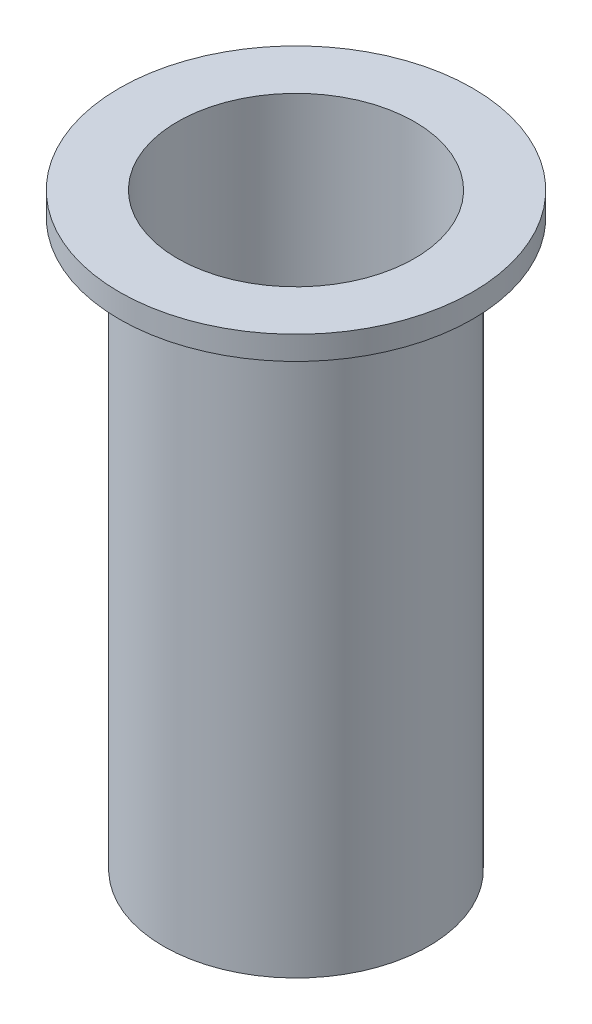
ISO-10303-21;
HEADER;
FILE_DESCRIPTION(('STEP AP214'),'2;1');
FILE_NAME('part.step','',(''),(''),'','','');
FILE_SCHEMA(('AUTOMOTIVE_DESIGN { 1 0 10303 214 1 1 1 1 }'));
ENDSEC;
DATA;
#1=APPLICATION_CONTEXT('core data for automotive mechanical design processes');
#2=APPLICATION_PROTOCOL_DEFINITION('international standard','automotive_design',2000,#1);
#3=PRODUCT_CONTEXT('',#1,'mechanical');
#4=PRODUCT('Part','Part','',(#3));
#5=PRODUCT_RELATED_PRODUCT_CATEGORY('part','',(#4));
#6=PRODUCT_DEFINITION_FORMATION('','',#4);
#7=PRODUCT_DEFINITION_CONTEXT('part definition',#1,'design');
#8=PRODUCT_DEFINITION('design','',#6,#7);
#9=PRODUCT_DEFINITION_SHAPE('','',#8);
#10=(LENGTH_UNIT() NAMED_UNIT(*) SI_UNIT(.MILLI.,.METRE.));
#11=(NAMED_UNIT(*) PLANE_ANGLE_UNIT() SI_UNIT($,.RADIAN.));
#12=(NAMED_UNIT(*) SI_UNIT($,.STERADIAN.) SOLID_ANGLE_UNIT());
#13=UNCERTAINTY_MEASURE_WITH_UNIT(LENGTH_MEASURE(1.E-05),#10,'distance_accuracy_value','');
#14=(GEOMETRIC_REPRESENTATION_CONTEXT(3) GLOBAL_UNCERTAINTY_ASSIGNED_CONTEXT((#13)) GLOBAL_UNIT_ASSIGNED_CONTEXT((#10,
#11,#12)) REPRESENTATION_CONTEXT('',''));
#15=CARTESIAN_POINT('',(0.,0.,0.));
#16=DIRECTION('',(0.,0.,1.));
#17=DIRECTION('',(1.,0.,0.));
#18=AXIS2_PLACEMENT_3D('',#15,#16,#17);
#19=CARTESIAN_POINT('',(51.1302,0.,0.));
#20=DIRECTION('',(0.,1.,0.));
#21=DIRECTION('',(0.,0.,1.));
#22=AXIS2_PLACEMENT_3D('',#19,#20,#21);
#23=PLANE('',#22);
#24=CARTESIAN_POINT('',(0.,0.,0.));
#25=DIRECTION('',(0.,1.,0.));
#26=DIRECTION('',(0.,0.,1.));
#27=AXIS2_PLACEMENT_3D('',#24,#25,#26);
#28=CIRCLE('',#27,57.15);
#29=CARTESIAN_POINT('',(0.,0.,57.15));
#30=VERTEX_POINT('',#29);
#31=EDGE_CURVE('E10',#30,#30,#28,.T.);
#32=ORIENTED_EDGE('',*,*,#31,.F.);
#33=EDGE_LOOP('',(#32));
#34=FACE_BOUND('',#33,.T.);
#35=CARTESIAN_POINT('',(0.,0.,0.));
#36=DIRECTION('',(0.,1.,0.));
#37=DIRECTION('',(0.,0.,1.));
#38=AXIS2_PLACEMENT_3D('',#35,#36,#37);
#39=CIRCLE('',#38,51.1302);
#40=CARTESIAN_POINT('',(0.,0.,51.1302));
#41=VERTEX_POINT('',#40);
#42=EDGE_CURVE('E58',#41,#41,#39,.T.);
#43=ORIENTED_EDGE('',*,*,#42,.T.);
#44=EDGE_LOOP('',(#43));
#45=FACE_BOUND('',#44,.T.);
#46=ADVANCED_FACE('F36',(#34,#45),#23,.F.);
#47=CARTESIAN_POINT('',(0.,0.,0.));
#48=DIRECTION('',(0.,1.,0.));
#49=DIRECTION('',(0.,0.,1.));
#50=AXIS2_PLACEMENT_3D('',#47,#48,#49);
#51=CYLINDRICAL_SURFACE('',#50,57.15);
#52=CARTESIAN_POINT('',(0.,243.84,0.));
#53=DIRECTION('',(0.,1.,0.));
#54=DIRECTION('',(0.,0.,1.));
#55=AXIS2_PLACEMENT_3D('',#52,#53,#54);
#56=CIRCLE('',#55,57.15);
#57=CARTESIAN_POINT('',(0.,243.84,57.15));
#58=VERTEX_POINT('',#57);
#59=EDGE_CURVE('E42',#58,#58,#56,.T.);
#60=ORIENTED_EDGE('',*,*,#59,.F.);
#61=EDGE_LOOP('',(#60));
#62=FACE_BOUND('',#61,.T.);
#63=ORIENTED_EDGE('',*,*,#31,.T.);
#64=EDGE_LOOP('',(#63));
#65=FACE_BOUND('',#64,.T.);
#66=ADVANCED_FACE('F83',(#62,#65),#51,.T.);
#67=CARTESIAN_POINT('',(57.15,243.84,0.));
#68=DIRECTION('',(0.,1.,0.));
#69=DIRECTION('',(0.,0.,1.));
#70=AXIS2_PLACEMENT_3D('',#67,#68,#69);
#71=PLANE('',#70);
#72=CARTESIAN_POINT('',(0.,243.84,0.));
#73=DIRECTION('',(0.,1.,0.));
#74=DIRECTION('',(0.,0.,1.));
#75=AXIS2_PLACEMENT_3D('',#72,#73,#74);
#76=CIRCLE('',#75,76.2);
#77=CARTESIAN_POINT('',(0.,243.84,76.2));
#78=VERTEX_POINT('',#77);
#79=EDGE_CURVE('E46',#78,#78,#76,.T.);
#80=ORIENTED_EDGE('',*,*,#79,.F.);
#81=EDGE_LOOP('',(#80));
#82=FACE_BOUND('',#81,.T.);
#83=ORIENTED_EDGE('',*,*,#59,.T.);
#84=EDGE_LOOP('',(#83));
#85=FACE_BOUND('',#84,.T.);
#86=ADVANCED_FACE('F78',(#82,#85),#71,.F.);
#87=CARTESIAN_POINT('',(0.,0.,0.));
#88=DIRECTION('',(0.,1.,0.));
#89=DIRECTION('',(0.,0.,1.));
#90=AXIS2_PLACEMENT_3D('',#87,#88,#89);
#91=CYLINDRICAL_SURFACE('',#90,76.2);
#92=CARTESIAN_POINT('',(0.,254.,0.));
#93=DIRECTION('',(0.,1.,0.));
#94=DIRECTION('',(0.,0.,1.));
#95=AXIS2_PLACEMENT_3D('',#92,#93,#94);
#96=CIRCLE('',#95,76.2);
#97=CARTESIAN_POINT('',(0.,254.,76.2));
#98=VERTEX_POINT('',#97);
#99=EDGE_CURVE('E50',#98,#98,#96,.T.);
#100=ORIENTED_EDGE('',*,*,#99,.F.);
#101=EDGE_LOOP('',(#100));
#102=FACE_BOUND('',#101,.T.);
#103=ORIENTED_EDGE('',*,*,#79,.T.);
#104=EDGE_LOOP('',(#103));
#105=FACE_BOUND('',#104,.T.);
#106=ADVANCED_FACE('F72',(#102,#105),#91,.T.);
#107=CARTESIAN_POINT('',(76.2,254.,0.));
#108=DIRECTION('',(0.,-1.,0.));
#109=DIRECTION('',(0.,0.,-1.));
#110=AXIS2_PLACEMENT_3D('',#107,#108,#109);
#111=PLANE('',#110);
#112=CARTESIAN_POINT('',(0.,254.,0.));
#113=DIRECTION('',(0.,1.,0.));
#114=DIRECTION('',(0.,0.,1.));
#115=AXIS2_PLACEMENT_3D('',#112,#113,#114);
#116=CIRCLE('',#115,51.1302);
#117=CARTESIAN_POINT('',(0.,254.,51.1302));
#118=VERTEX_POINT('',#117);
#119=EDGE_CURVE('E55',#118,#118,#116,.T.);
#120=ORIENTED_EDGE('',*,*,#119,.F.);
#121=EDGE_LOOP('',(#120));
#122=FACE_BOUND('',#121,.T.);
#123=ORIENTED_EDGE('',*,*,#99,.T.);
#124=EDGE_LOOP('',(#123));
#125=FACE_BOUND('',#124,.T.);
#126=ADVANCED_FACE('F66',(#122,#125),#111,.F.);
#127=CARTESIAN_POINT('',(0.,0.,0.));
#128=DIRECTION('',(0.,1.,0.));
#129=DIRECTION('',(0.,0.,1.));
#130=AXIS2_PLACEMENT_3D('',#127,#128,#129);
#131=CYLINDRICAL_SURFACE('',#130,51.1302);
#132=ORIENTED_EDGE('',*,*,#42,.F.);
#133=EDGE_LOOP('',(#132));
#134=FACE_BOUND('',#133,.T.);
#135=ORIENTED_EDGE('',*,*,#119,.T.);
#136=EDGE_LOOP('',(#135));
#137=FACE_BOUND('',#136,.T.);
#138=ADVANCED_FACE('F63',(#134,#137),#131,.F.);
#139=CLOSED_SHELL('',(#46,#66,#86,#106,#126,#138));
#140=MANIFOLD_SOLID_BREP('B2',#139);
#141=ADVANCED_BREP_SHAPE_REPRESENTATION('',(#18,#140),#14);
#142=SHAPE_DEFINITION_REPRESENTATION(#9,#141);
ENDSEC;
END-ISO-10303-21;
